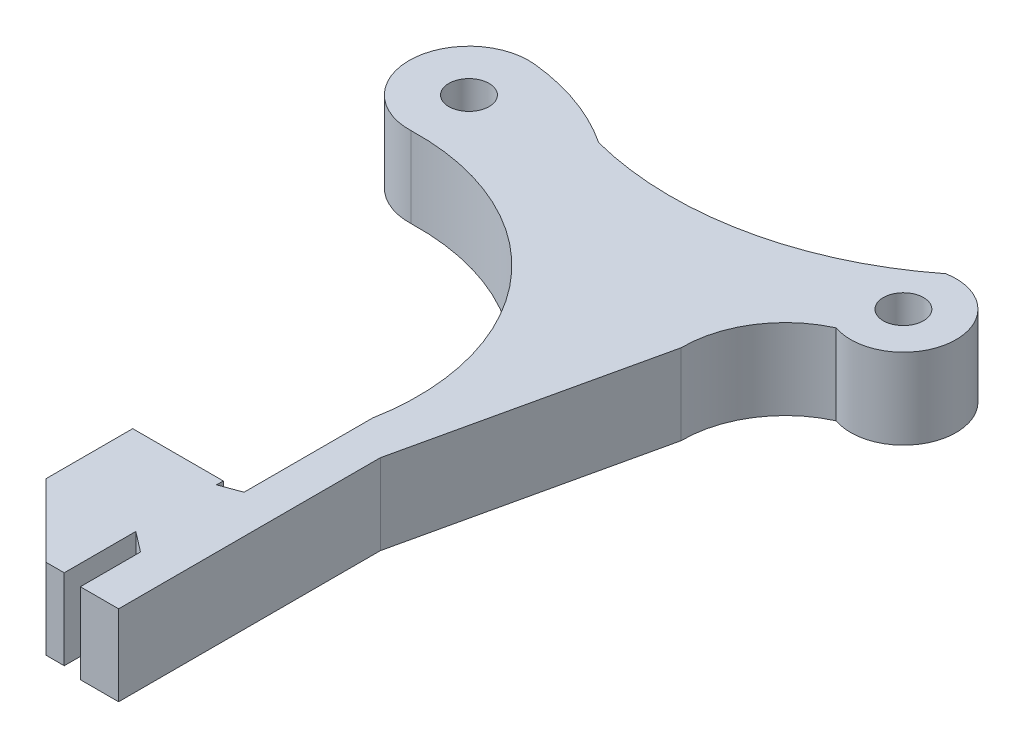
ISO-10303-21;
HEADER;
FILE_DESCRIPTION(('STEP AP214'),'2;1');
FILE_NAME('part.step','',(''),(''),'','','');
FILE_SCHEMA(('AUTOMOTIVE_DESIGN { 1 0 10303 214 1 1 1 1 }'));
ENDSEC;
DATA;
#1=APPLICATION_CONTEXT('core data for automotive mechanical design processes');
#2=APPLICATION_PROTOCOL_DEFINITION('international standard','automotive_design',2000,#1);
#3=PRODUCT_CONTEXT('',#1,'mechanical');
#4=PRODUCT('Part','Part','',(#3));
#5=PRODUCT_RELATED_PRODUCT_CATEGORY('part','',(#4));
#6=PRODUCT_DEFINITION_FORMATION('','',#4);
#7=PRODUCT_DEFINITION_CONTEXT('part definition',#1,'design');
#8=PRODUCT_DEFINITION('design','',#6,#7);
#9=PRODUCT_DEFINITION_SHAPE('','',#8);
#10=(LENGTH_UNIT() NAMED_UNIT(*) SI_UNIT(.MILLI.,.METRE.));
#11=(NAMED_UNIT(*) PLANE_ANGLE_UNIT() SI_UNIT($,.RADIAN.));
#12=(NAMED_UNIT(*) SI_UNIT($,.STERADIAN.) SOLID_ANGLE_UNIT());
#13=UNCERTAINTY_MEASURE_WITH_UNIT(LENGTH_MEASURE(1.E-05),#10,'distance_accuracy_value','');
#14=(GEOMETRIC_REPRESENTATION_CONTEXT(3) GLOBAL_UNCERTAINTY_ASSIGNED_CONTEXT((#13)) GLOBAL_UNIT_ASSIGNED_CONTEXT((#10,
#11,#12)) REPRESENTATION_CONTEXT('',''));
#15=CARTESIAN_POINT('',(0.,0.,0.));
#16=DIRECTION('',(0.,0.,1.));
#17=DIRECTION('',(1.,0.,0.));
#18=AXIS2_PLACEMENT_3D('',#15,#16,#17);
#19=CARTESIAN_POINT('',(29.4384156793673,10.,2.55506738943392));
#20=DIRECTION('',(0.607857799966434,0.,-0.794045902338125));
#21=DIRECTION('',(-0.794045902338125,0.,-0.607857799966434));
#22=AXIS2_PLACEMENT_3D('',#19,#20,#21);
#23=PLANE('',#22);
#24=DIRECTION('',(0.,-1.,0.));
#25=VECTOR('',#24,1.);
#26=CARTESIAN_POINT('',(28.75,10.,2.02807160859757));
#27=LINE('',#26,#25);
#28=CARTESIAN_POINT('',(28.75,10.,2.02807160859757));
#29=VERTEX_POINT('',#28);
#30=CARTESIAN_POINT('',(28.75,0.,2.02807160859757));
#31=VERTEX_POINT('',#30);
#32=EDGE_CURVE('E63',#29,#31,#27,.T.);
#33=ORIENTED_EDGE('',*,*,#32,.F.);
#34=DIRECTION('',(0.794045902338125,0.,0.607857799966434));
#35=VECTOR('',#34,1.);
#36=CARTESIAN_POINT('',(29.4384156793673,10.,2.55506738943392));
#37=LINE('',#36,#35);
#38=CARTESIAN_POINT('',(26.25,10.,0.114272298707066));
#39=VERTEX_POINT('',#38);
#40=EDGE_CURVE('E183',#39,#29,#37,.T.);
#41=ORIENTED_EDGE('',*,*,#40,.F.);
#42=DIRECTION('',(0.,-1.,0.));
#43=VECTOR('',#42,1.);
#44=CARTESIAN_POINT('',(26.25,10.,0.114272298707066));
#45=LINE('',#44,#43);
#46=CARTESIAN_POINT('',(26.25,0.,0.114272298707066));
#47=VERTEX_POINT('',#46);
#48=EDGE_CURVE('E229',#39,#47,#45,.T.);
#49=ORIENTED_EDGE('',*,*,#48,.T.);
#50=DIRECTION('',(0.794045902338125,0.,0.607857799966434));
#51=VECTOR('',#50,1.);
#52=CARTESIAN_POINT('',(29.4384156793673,0.,2.55506738943392));
#53=LINE('',#52,#51);
#54=EDGE_CURVE('E68',#47,#31,#53,.T.);
#55=ORIENTED_EDGE('',*,*,#54,.T.);
#56=EDGE_LOOP('',(#33,#41,#49,#55));
#57=FACE_BOUND('',#56,.T.);
#58=ADVANCED_FACE('F45',(#57),#23,.F.);
#59=CARTESIAN_POINT('',(26.25,10.,-9.9119859171796));
#60=DIRECTION('',(0.342233287778515,0.,0.939615015171803));
#61=DIRECTION('',(0.939615015171803,0.,-0.342233287778515));
#62=AXIS2_PLACEMENT_3D('',#59,#60,#61);
#63=PLANE('',#62);
#64=DIRECTION('',(0.,1.,0.));
#65=VECTOR('',#64,1.);
#66=CARTESIAN_POINT('',(28.75,10.,-10.8225537621282));
#67=LINE('',#66,#65);
#68=CARTESIAN_POINT('',(28.75,0.,-10.8225537621282));
#69=VERTEX_POINT('',#68);
#70=CARTESIAN_POINT('',(28.75,10.,-10.8225537621282));
#71=VERTEX_POINT('',#70);
#72=EDGE_CURVE('E205',#69,#71,#67,.T.);
#73=ORIENTED_EDGE('',*,*,#72,.F.);
#74=DIRECTION('',(-0.939615015171803,0.,0.342233287778515));
#75=VECTOR('',#74,1.);
#76=CARTESIAN_POINT('',(26.25,0.,-9.9119859171796));
#77=LINE('',#76,#75);
#78=CARTESIAN_POINT('',(26.25,0.,-9.9119859171796));
#79=VERTEX_POINT('',#78);
#80=EDGE_CURVE('E251',#69,#79,#77,.T.);
#81=ORIENTED_EDGE('',*,*,#80,.T.);
#82=DIRECTION('',(0.,-1.,0.));
#83=VECTOR('',#82,1.);
#84=CARTESIAN_POINT('',(26.25,10.,-9.9119859171796));
#85=LINE('',#84,#83);
#86=CARTESIAN_POINT('',(26.25,10.,-9.9119859171796));
#87=VERTEX_POINT('',#86);
#88=EDGE_CURVE('E232',#87,#79,#85,.T.);
#89=ORIENTED_EDGE('',*,*,#88,.F.);
#90=DIRECTION('',(-0.939615015171803,0.,0.342233287778515));
#91=VECTOR('',#90,1.);
#92=CARTESIAN_POINT('',(26.25,10.,-9.9119859171796));
#93=LINE('',#92,#91);
#94=EDGE_CURVE('E269',#71,#87,#93,.T.);
#95=ORIENTED_EDGE('',*,*,#94,.F.);
#96=EDGE_LOOP('',(#73,#81,#89,#95));
#97=FACE_BOUND('',#96,.T.);
#98=ADVANCED_FACE('F304',(#97),#63,.F.);
#99=CARTESIAN_POINT('',(15.,10.,-10.75));
#100=DIRECTION('',(1.,0.,0.));
#101=DIRECTION('',(0.,0.,-1.));
#102=AXIS2_PLACEMENT_3D('',#99,#100,#101);
#103=PLANE('',#102);
#104=DIRECTION('',(0.,0.,1.));
#105=VECTOR('',#104,1.);
#106=CARTESIAN_POINT('',(15.,0.,-10.75));
#107=LINE('',#106,#105);
#108=CARTESIAN_POINT('',(15.,0.,-10.75));
#109=VERTEX_POINT('',#108);
#110=CARTESIAN_POINT('',(15.,0.,0.));
#111=VERTEX_POINT('',#110);
#112=EDGE_CURVE('E11',#109,#111,#107,.T.);
#113=ORIENTED_EDGE('',*,*,#112,.T.);
#114=DIRECTION('',(0.,-1.,0.));
#115=VECTOR('',#114,1.);
#116=CARTESIAN_POINT('',(15.,10.,0.));
#117=LINE('',#116,#115);
#118=CARTESIAN_POINT('',(15.,10.,0.));
#119=VERTEX_POINT('',#118);
#120=EDGE_CURVE('E217',#119,#111,#117,.T.);
#121=ORIENTED_EDGE('',*,*,#120,.F.);
#122=DIRECTION('',(0.,0.,1.));
#123=VECTOR('',#122,1.);
#124=CARTESIAN_POINT('',(15.,10.,-10.75));
#125=LINE('',#124,#123);
#126=CARTESIAN_POINT('',(15.,10.,-10.75));
#127=VERTEX_POINT('',#126);
#128=EDGE_CURVE('E49',#127,#119,#125,.T.);
#129=ORIENTED_EDGE('',*,*,#128,.F.);
#130=DIRECTION('',(0.,-1.,0.));
#131=VECTOR('',#130,1.);
#132=CARTESIAN_POINT('',(15.,10.,-10.75));
#133=LINE('',#132,#131);
#134=EDGE_CURVE('E240',#127,#109,#133,.T.);
#135=ORIENTED_EDGE('',*,*,#134,.T.);
#136=EDGE_LOOP('',(#113,#121,#129,#135));
#137=FACE_BOUND('',#136,.T.);
#138=ADVANCED_FACE('F289',(#137),#103,.F.);
#139=CARTESIAN_POINT('',(15.,10.,0.));
#140=DIRECTION('',(0.707705839144414,0.,-0.706507215278727));
#141=DIRECTION('',(-0.706507215278727,0.,-0.707705839144414));
#142=AXIS2_PLACEMENT_3D('',#139,#140,#141);
#143=PLANE('',#142);
#144=DIRECTION('',(0.706507215278727,0.,0.707705839144414));
#145=VECTOR('',#144,1.);
#146=CARTESIAN_POINT('',(15.,0.,0.));
#147=LINE('',#146,#145);
#148=CARTESIAN_POINT('',(23.984756922729,0.,9.));
#149=VERTEX_POINT('',#148);
#150=EDGE_CURVE('E55',#111,#149,#147,.T.);
#151=ORIENTED_EDGE('',*,*,#150,.T.);
#152=DIRECTION('',(0.,-1.,0.));
#153=VECTOR('',#152,1.);
#154=CARTESIAN_POINT('',(23.984756922729,10.,9.));
#155=LINE('',#154,#153);
#156=CARTESIAN_POINT('',(23.984756922729,10.,9.));
#157=VERTEX_POINT('',#156);
#158=EDGE_CURVE('E221',#157,#149,#155,.T.);
#159=ORIENTED_EDGE('',*,*,#158,.F.);
#160=DIRECTION('',(0.706507215278727,0.,0.707705839144414));
#161=VECTOR('',#160,1.);
#162=CARTESIAN_POINT('',(15.,10.,0.));
#163=LINE('',#162,#161);
#164=EDGE_CURVE('E279',#119,#157,#163,.T.);
#165=ORIENTED_EDGE('',*,*,#164,.F.);
#166=ORIENTED_EDGE('',*,*,#120,.T.);
#167=EDGE_LOOP('',(#151,#159,#165,#166));
#168=FACE_BOUND('',#167,.T.);
#169=ADVANCED_FACE('F292',(#168),#143,.F.);
#170=CARTESIAN_POINT('',(23.984756922729,10.,9.));
#171=DIRECTION('',(0.,0.,-1.));
#172=DIRECTION('',(-1.,0.,0.));
#173=AXIS2_PLACEMENT_3D('',#170,#171,#172);
#174=PLANE('',#173);
#175=DIRECTION('',(1.,0.,0.));
#176=VECTOR('',#175,1.);
#177=CARTESIAN_POINT('',(23.984756922729,0.,9.));
#178=LINE('',#177,#176);
#179=CARTESIAN_POINT('',(26.25,0.,9.));
#180=VERTEX_POINT('',#179);
#181=EDGE_CURVE('E259',#149,#180,#178,.T.);
#182=ORIENTED_EDGE('',*,*,#181,.T.);
#183=DIRECTION('',(0.,-1.,0.));
#184=VECTOR('',#183,1.);
#185=CARTESIAN_POINT('',(26.25,10.,9.));
#186=LINE('',#185,#184);
#187=CARTESIAN_POINT('',(26.25,10.,9.));
#188=VERTEX_POINT('',#187);
#189=EDGE_CURVE('E225',#188,#180,#186,.T.);
#190=ORIENTED_EDGE('',*,*,#189,.F.);
#191=DIRECTION('',(1.,0.,0.));
#192=VECTOR('',#191,1.);
#193=CARTESIAN_POINT('',(23.984756922729,10.,9.));
#194=LINE('',#193,#192);
#195=EDGE_CURVE('E277',#157,#188,#194,.T.);
#196=ORIENTED_EDGE('',*,*,#195,.F.);
#197=ORIENTED_EDGE('',*,*,#158,.T.);
#198=EDGE_LOOP('',(#182,#190,#196,#197));
#199=FACE_BOUND('',#198,.T.);
#200=ADVANCED_FACE('F297',(#199),#174,.F.);
#201=CARTESIAN_POINT('',(26.25,10.,9.));
#202=DIRECTION('',(-1.,0.,0.));
#203=DIRECTION('',(0.,0.,1.));
#204=AXIS2_PLACEMENT_3D('',#201,#202,#203);
#205=PLANE('',#204);
#206=DIRECTION('',(0.,0.,-1.));
#207=VECTOR('',#206,1.);
#208=CARTESIAN_POINT('',(26.25,0.,9.));
#209=LINE('',#208,#207);
#210=EDGE_CURVE('E256',#180,#47,#209,.T.);
#211=ORIENTED_EDGE('',*,*,#210,.T.);
#212=ORIENTED_EDGE('',*,*,#48,.F.);
#213=DIRECTION('',(0.,0.,-1.));
#214=VECTOR('',#213,1.);
#215=CARTESIAN_POINT('',(26.25,10.,9.));
#216=LINE('',#215,#214);
#217=EDGE_CURVE('E274',#188,#39,#216,.T.);
#218=ORIENTED_EDGE('',*,*,#217,.F.);
#219=ORIENTED_EDGE('',*,*,#189,.T.);
#220=EDGE_LOOP('',(#211,#212,#218,#219));
#221=FACE_BOUND('',#220,.T.);
#222=ADVANCED_FACE('F301',(#221),#205,.F.);
#223=CARTESIAN_POINT('',(26.25,10.,-10.75));
#224=DIRECTION('',(-1.,0.,0.));
#225=DIRECTION('',(0.,0.,1.));
#226=AXIS2_PLACEMENT_3D('',#223,#224,#225);
#227=PLANE('',#226);
#228=DIRECTION('',(0.,0.,-1.));
#229=VECTOR('',#228,1.);
#230=CARTESIAN_POINT('',(26.25,0.,-10.75));
#231=LINE('',#230,#229);
#232=CARTESIAN_POINT('',(26.25,0.,-10.75));
#233=VERTEX_POINT('',#232);
#234=EDGE_CURVE('E248',#79,#233,#231,.T.);
#235=ORIENTED_EDGE('',*,*,#234,.T.);
#236=DIRECTION('',(0.,-1.,0.));
#237=VECTOR('',#236,1.);
#238=CARTESIAN_POINT('',(26.25,10.,-10.75));
#239=LINE('',#238,#237);
#240=CARTESIAN_POINT('',(26.25,10.,-10.75));
#241=VERTEX_POINT('',#240);
#242=EDGE_CURVE('E236',#241,#233,#239,.T.);
#243=ORIENTED_EDGE('',*,*,#242,.F.);
#244=DIRECTION('',(0.,0.,-1.));
#245=VECTOR('',#244,1.);
#246=CARTESIAN_POINT('',(26.25,10.,-10.75));
#247=LINE('',#246,#245);
#248=EDGE_CURVE('E266',#87,#241,#247,.T.);
#249=ORIENTED_EDGE('',*,*,#248,.F.);
#250=ORIENTED_EDGE('',*,*,#88,.T.);
#251=EDGE_LOOP('',(#235,#243,#249,#250));
#252=FACE_BOUND('',#251,.T.);
#253=ADVANCED_FACE('F315',(#252),#227,.F.);
#254=CARTESIAN_POINT('',(26.25,10.,-10.75));
#255=DIRECTION('',(0.,0.,1.));
#256=DIRECTION('',(1.,0.,0.));
#257=AXIS2_PLACEMENT_3D('',#254,#255,#256);
#258=PLANE('',#257);
#259=DIRECTION('',(-1.,0.,0.));
#260=VECTOR('',#259,1.);
#261=CARTESIAN_POINT('',(26.25,0.,-10.75));
#262=LINE('',#261,#260);
#263=EDGE_CURVE('E245',#233,#109,#262,.T.);
#264=ORIENTED_EDGE('',*,*,#263,.T.);
#265=ORIENTED_EDGE('',*,*,#134,.F.);
#266=DIRECTION('',(-1.,0.,0.));
#267=VECTOR('',#266,1.);
#268=CARTESIAN_POINT('',(26.25,10.,-10.75));
#269=LINE('',#268,#267);
#270=EDGE_CURVE('E244',#241,#127,#269,.T.);
#271=ORIENTED_EDGE('',*,*,#270,.F.);
#272=ORIENTED_EDGE('',*,*,#242,.T.);
#273=EDGE_LOOP('',(#264,#265,#271,#272));
#274=FACE_BOUND('',#273,.T.);
#275=ADVANCED_FACE('F318',(#274),#258,.F.);
#276=CARTESIAN_POINT('',(0.,10.,0.));
#277=DIRECTION('',(0.,1.,0.));
#278=DIRECTION('',(0.,0.,1.));
#279=AXIS2_PLACEMENT_3D('',#276,#277,#278);
#280=PLANE('',#279);
#281=ORIENTED_EDGE('',*,*,#40,.T.);
#282=DIRECTION('',(0.,0.,1.));
#283=VECTOR('',#282,1.);
#284=CARTESIAN_POINT('',(28.75,10.,9.5));
#285=LINE('',#284,#283);
#286=CARTESIAN_POINT('',(28.75,10.,9.5));
#287=VERTEX_POINT('',#286);
#288=EDGE_CURVE('E178',#29,#287,#285,.T.);
#289=ORIENTED_EDGE('',*,*,#288,.T.);
#290=DIRECTION('',(1.,0.,0.));
#291=VECTOR('',#290,1.);
#292=CARTESIAN_POINT('',(28.75,10.,9.5));
#293=LINE('',#292,#291);
#294=CARTESIAN_POINT('',(33.5,10.,9.5));
#295=VERTEX_POINT('',#294);
#296=EDGE_CURVE('E181',#287,#295,#293,.T.);
#297=ORIENTED_EDGE('',*,*,#296,.T.);
#298=DIRECTION('',(0.,0.,-1.));
#299=VECTOR('',#298,1.);
#300=CARTESIAN_POINT('',(33.5,10.,9.5));
#301=LINE('',#300,#299);
#302=CARTESIAN_POINT('',(33.5,10.,-22.9964795118963));
#303=VERTEX_POINT('',#302);
#304=EDGE_CURVE('E198',#295,#303,#301,.T.);
#305=ORIENTED_EDGE('',*,*,#304,.T.);
#306=DIRECTION('',(0.219110296994239,0.,-0.975700096213532));
#307=VECTOR('',#306,1.);
#308=CARTESIAN_POINT('',(33.5,10.,-22.9964795118963));
#309=LINE('',#308,#307);
#310=CARTESIAN_POINT('',(40.3451918816469,10.,-53.4781796836529));
#311=VERTEX_POINT('',#310);
#312=EDGE_CURVE('E355',#303,#311,#309,.T.);
#313=ORIENTED_EDGE('',*,*,#312,.T.);
#314=CARTESIAN_POINT('',(53.1709551408232,10.,-53.5974267366871));
#315=DIRECTION('',(0.,-1.,0.));
#316=DIRECTION('',(0.,0.,-1.));
#317=AXIS2_PLACEMENT_3D('',#314,#315,#316);
#318=CIRCLE('',#317,12.8263175946994);
#319=CARTESIAN_POINT('',(47.8361175296124,10.,-65.2616425569686));
#320=VERTEX_POINT('',#319);
#321=EDGE_CURVE('E358',#311,#320,#318,.T.);
#322=ORIENTED_EDGE('',*,*,#321,.T.);
#323=CARTESIAN_POINT('',(50.,10.,-71.4441639009332));
#324=DIRECTION('',(0.,1.,0.));
#325=DIRECTION('',(0.,0.,1.));
#326=AXIS2_PLACEMENT_3D('',#323,#324,#325);
#327=CIRCLE('',#326,6.55026392706654);
#328=CARTESIAN_POINT('',(48.8157417172947,10.,-77.8864841222567));
#329=VERTEX_POINT('',#328);
#330=EDGE_CURVE('E361',#320,#329,#327,.T.);
#331=ORIENTED_EDGE('',*,*,#330,.T.);
#332=CARTESIAN_POINT('',(23.4650928294995,10.,-110.161503233853));
#333=DIRECTION('',(0.,-1.,0.));
#334=DIRECTION('',(0.,0.,1.));
#335=AXIS2_PLACEMENT_3D('',#332,#333,#334);
#336=CIRCLE('',#335,41.0406171698983);
#337=CARTESIAN_POINT('',(13.1801068471703,10.,-70.4305163215011));
#338=VERTEX_POINT('',#337);
#339=EDGE_CURVE('E364',#329,#338,#336,.T.);
#340=ORIENTED_EDGE('',*,*,#339,.T.);
#341=CARTESIAN_POINT('',(-2.07481433490464,10.,-47.4665819523747));
#342=DIRECTION('',(0.,1.,0.));
#343=DIRECTION('',(0.,0.,-1.));
#344=AXIS2_PLACEMENT_3D('',#341,#342,#343);
#345=CIRCLE('',#344,27.5690932382779);
#346=CARTESIAN_POINT('',(0.765261216815038,10.,-74.8889974703663));
#347=VERTEX_POINT('',#346);
#348=EDGE_CURVE('E367',#338,#347,#345,.T.);
#349=ORIENTED_EDGE('',*,*,#348,.T.);
#350=CARTESIAN_POINT('',(0.,10.,-67.5));
#351=DIRECTION('',(0.,1.,0.));
#352=DIRECTION('',(0.,0.,1.));
#353=AXIS2_PLACEMENT_3D('',#350,#351,#352);
#354=CIRCLE('',#353,7.4285199297734);
#355=CARTESIAN_POINT('',(0.226137572536466,10.,-60.0749228862369));
#356=VERTEX_POINT('',#355);
#357=EDGE_CURVE('E370',#347,#356,#354,.T.);
#358=ORIENTED_EDGE('',*,*,#357,.T.);
#359=CARTESIAN_POINT('',(1.08287422660641,10.,-31.944543439315));
#360=DIRECTION('',(0.,-1.,0.));
#361=DIRECTION('',(0.,0.,-1.));
#362=AXIS2_PLACEMENT_3D('',#359,#360,#361);
#363=CIRCLE('',#362,28.1434227755303);
#364=CARTESIAN_POINT('',(28.75,10.,-26.7887314798407));
#365=VERTEX_POINT('',#364);
#366=EDGE_CURVE('E373',#356,#365,#363,.T.);
#367=ORIENTED_EDGE('',*,*,#366,.T.);
#368=EDGE_CURVE('E187',#365,#71,#285,.T.);
#369=ORIENTED_EDGE('',*,*,#368,.T.);
#370=ORIENTED_EDGE('',*,*,#94,.T.);
#371=ORIENTED_EDGE('',*,*,#248,.T.);
#372=ORIENTED_EDGE('',*,*,#270,.T.);
#373=ORIENTED_EDGE('',*,*,#128,.T.);
#374=ORIENTED_EDGE('',*,*,#164,.T.);
#375=ORIENTED_EDGE('',*,*,#195,.T.);
#376=ORIENTED_EDGE('',*,*,#217,.T.);
#377=EDGE_LOOP('',(#281,#289,#297,#305,#313,#322,#331,#340,#349,#358,#367,#369,#370,#371,#372,
#373,#374,#375,#376));
#378=FACE_BOUND('',#377,.T.);
#379=CARTESIAN_POINT('',(0.,10.,-67.5));
#380=DIRECTION('',(0.,1.,0.));
#381=DIRECTION('',(0.,0.,1.));
#382=AXIS2_PLACEMENT_3D('',#379,#380,#381);
#383=CIRCLE('',#382,2.5);
#384=CARTESIAN_POINT('',(0.,10.,-65.));
#385=VERTEX_POINT('',#384);
#386=EDGE_CURVE('E340',#385,#385,#383,.T.);
#387=ORIENTED_EDGE('',*,*,#386,.F.);
#388=EDGE_LOOP('',(#387));
#389=FACE_BOUND('',#388,.T.);
#390=CARTESIAN_POINT('',(50.,10.,-71.4441639009332));
#391=DIRECTION('',(0.,1.,0.));
#392=DIRECTION('',(0.,0.,1.));
#393=AXIS2_PLACEMENT_3D('',#390,#391,#392);
#394=CIRCLE('',#393,2.5);
#395=CARTESIAN_POINT('',(50.,10.,-68.9441639009332));
#396=VERTEX_POINT('',#395);
#397=EDGE_CURVE('E341',#396,#396,#394,.T.);
#398=ORIENTED_EDGE('',*,*,#397,.F.);
#399=EDGE_LOOP('',(#398));
#400=FACE_BOUND('',#399,.T.);
#401=ADVANCED_FACE('F47',(#378,#389,#400),#280,.T.);
#402=CARTESIAN_POINT('',(0.,0.,0.));
#403=DIRECTION('',(0.,1.,0.));
#404=DIRECTION('',(0.,0.,1.));
#405=AXIS2_PLACEMENT_3D('',#402,#403,#404);
#406=PLANE('',#405);
#407=DIRECTION('',(0.,0.,1.));
#408=VECTOR('',#407,1.);
#409=CARTESIAN_POINT('',(28.75,0.,9.5));
#410=LINE('',#409,#408);
#411=CARTESIAN_POINT('',(28.75,0.,9.5));
#412=VERTEX_POINT('',#411);
#413=EDGE_CURVE('E202',#31,#412,#410,.T.);
#414=ORIENTED_EDGE('',*,*,#413,.F.);
#415=ORIENTED_EDGE('',*,*,#54,.F.);
#416=ORIENTED_EDGE('',*,*,#210,.F.);
#417=ORIENTED_EDGE('',*,*,#181,.F.);
#418=ORIENTED_EDGE('',*,*,#150,.F.);
#419=ORIENTED_EDGE('',*,*,#112,.F.);
#420=ORIENTED_EDGE('',*,*,#263,.F.);
#421=ORIENTED_EDGE('',*,*,#234,.F.);
#422=ORIENTED_EDGE('',*,*,#80,.F.);
#423=CARTESIAN_POINT('',(28.75,0.,-26.7887314798407));
#424=VERTEX_POINT('',#423);
#425=EDGE_CURVE('E377',#424,#69,#410,.T.);
#426=ORIENTED_EDGE('',*,*,#425,.F.);
#427=CARTESIAN_POINT('',(1.08287422660641,0.,-31.944543439315));
#428=DIRECTION('',(0.,-1.,0.));
#429=DIRECTION('',(0.,0.,-1.));
#430=AXIS2_PLACEMENT_3D('',#427,#428,#429);
#431=CIRCLE('',#430,28.1434227755303);
#432=CARTESIAN_POINT('',(0.226137572536466,0.,-60.0749228862369));
#433=VERTEX_POINT('',#432);
#434=EDGE_CURVE('E188',#433,#424,#431,.T.);
#435=ORIENTED_EDGE('',*,*,#434,.F.);
#436=CARTESIAN_POINT('',(0.,0.,-67.5));
#437=DIRECTION('',(0.,1.,0.));
#438=DIRECTION('',(0.,0.,1.));
#439=AXIS2_PLACEMENT_3D('',#436,#437,#438);
#440=CIRCLE('',#439,7.4285199297734);
#441=CARTESIAN_POINT('',(0.765261216815038,0.,-74.8889974703663));
#442=VERTEX_POINT('',#441);
#443=EDGE_CURVE('E402',#442,#433,#440,.T.);
#444=ORIENTED_EDGE('',*,*,#443,.F.);
#445=CARTESIAN_POINT('',(-2.07481433490464,0.,-47.4665819523747));
#446=DIRECTION('',(0.,1.,0.));
#447=DIRECTION('',(0.,0.,-1.));
#448=AXIS2_PLACEMENT_3D('',#445,#446,#447);
#449=CIRCLE('',#448,27.5690932382779);
#450=CARTESIAN_POINT('',(13.1801068471703,0.,-70.4305163215011));
#451=VERTEX_POINT('',#450);
#452=EDGE_CURVE('E399',#451,#442,#449,.T.);
#453=ORIENTED_EDGE('',*,*,#452,.F.);
#454=CARTESIAN_POINT('',(23.4650928294995,0.,-110.161503233853));
#455=DIRECTION('',(0.,-1.,0.));
#456=DIRECTION('',(0.,0.,1.));
#457=AXIS2_PLACEMENT_3D('',#454,#455,#456);
#458=CIRCLE('',#457,41.0406171698983);
#459=CARTESIAN_POINT('',(48.8157417172947,0.,-77.8864841222567));
#460=VERTEX_POINT('',#459);
#461=EDGE_CURVE('E396',#460,#451,#458,.T.);
#462=ORIENTED_EDGE('',*,*,#461,.F.);
#463=CARTESIAN_POINT('',(50.,0.,-71.4441639009332));
#464=DIRECTION('',(0.,1.,0.));
#465=DIRECTION('',(0.,0.,1.));
#466=AXIS2_PLACEMENT_3D('',#463,#464,#465);
#467=CIRCLE('',#466,6.55026392706654);
#468=CARTESIAN_POINT('',(47.8361175296124,0.,-65.2616425569686));
#469=VERTEX_POINT('',#468);
#470=EDGE_CURVE('E393',#469,#460,#467,.T.);
#471=ORIENTED_EDGE('',*,*,#470,.F.);
#472=CARTESIAN_POINT('',(53.1709551408232,0.,-53.5974267366871));
#473=DIRECTION('',(0.,-1.,0.));
#474=DIRECTION('',(0.,0.,-1.));
#475=AXIS2_PLACEMENT_3D('',#472,#473,#474);
#476=CIRCLE('',#475,12.8263175946994);
#477=CARTESIAN_POINT('',(40.3451918816469,0.,-53.4781796836529));
#478=VERTEX_POINT('',#477);
#479=EDGE_CURVE('E390',#478,#469,#476,.T.);
#480=ORIENTED_EDGE('',*,*,#479,.F.);
#481=DIRECTION('',(0.219110296994239,0.,-0.975700096213532));
#482=VECTOR('',#481,1.);
#483=CARTESIAN_POINT('',(33.5,0.,-22.9964795118963));
#484=LINE('',#483,#482);
#485=CARTESIAN_POINT('',(33.5,0.,-22.9964795118963));
#486=VERTEX_POINT('',#485);
#487=EDGE_CURVE('E387',#486,#478,#484,.T.);
#488=ORIENTED_EDGE('',*,*,#487,.F.);
#489=DIRECTION('',(0.,0.,-1.));
#490=VECTOR('',#489,1.);
#491=CARTESIAN_POINT('',(33.5,0.,9.5));
#492=LINE('',#491,#490);
#493=CARTESIAN_POINT('',(33.5,0.,9.5));
#494=VERTEX_POINT('',#493);
#495=EDGE_CURVE('E384',#494,#486,#492,.T.);
#496=ORIENTED_EDGE('',*,*,#495,.F.);
#497=DIRECTION('',(1.,0.,0.));
#498=VECTOR('',#497,1.);
#499=CARTESIAN_POINT('',(28.75,0.,9.5));
#500=LINE('',#499,#498);
#501=EDGE_CURVE('E381',#412,#494,#500,.T.);
#502=ORIENTED_EDGE('',*,*,#501,.F.);
#503=EDGE_LOOP('',(#414,#415,#416,#417,#418,#419,#420,#421,#422,#426,#435,#444,#453,#462,#471,
#480,#488,#496,#502));
#504=FACE_BOUND('',#503,.T.);
#505=CARTESIAN_POINT('',(50.,0.,-71.4441639009332));
#506=DIRECTION('',(0.,1.,0.));
#507=DIRECTION('',(0.,0.,1.));
#508=AXIS2_PLACEMENT_3D('',#505,#506,#507);
#509=CIRCLE('',#508,2.5);
#510=CARTESIAN_POINT('',(50.,0.,-68.9441639009332));
#511=VERTEX_POINT('',#510);
#512=EDGE_CURVE('E334',#511,#511,#509,.T.);
#513=ORIENTED_EDGE('',*,*,#512,.T.);
#514=EDGE_LOOP('',(#513));
#515=FACE_BOUND('',#514,.T.);
#516=CARTESIAN_POINT('',(0.,0.,-67.5));
#517=DIRECTION('',(0.,1.,0.));
#518=DIRECTION('',(0.,0.,1.));
#519=AXIS2_PLACEMENT_3D('',#516,#517,#518);
#520=CIRCLE('',#519,2.5);
#521=CARTESIAN_POINT('',(0.,0.,-65.));
#522=VERTEX_POINT('',#521);
#523=EDGE_CURVE('E337',#522,#522,#520,.T.);
#524=ORIENTED_EDGE('',*,*,#523,.T.);
#525=EDGE_LOOP('',(#524));
#526=FACE_BOUND('',#525,.T.);
#527=ADVANCED_FACE('F321',(#504,#515,#526),#406,.F.);
#528=CARTESIAN_POINT('',(28.75,10.,9.5));
#529=DIRECTION('',(1.,0.,0.));
#530=DIRECTION('',(0.,0.,-1.));
#531=AXIS2_PLACEMENT_3D('',#528,#529,#530);
#532=PLANE('',#531);
#533=ORIENTED_EDGE('',*,*,#288,.F.);
#534=ORIENTED_EDGE('',*,*,#32,.T.);
#535=ORIENTED_EDGE('',*,*,#413,.T.);
#536=DIRECTION('',(0.,-1.,0.));
#537=VECTOR('',#536,1.);
#538=CARTESIAN_POINT('',(28.75,10.,9.5));
#539=LINE('',#538,#537);
#540=EDGE_CURVE('E193',#287,#412,#539,.T.);
#541=ORIENTED_EDGE('',*,*,#540,.F.);
#542=EDGE_LOOP('',(#533,#534,#535,#541));
#543=FACE_BOUND('',#542,.T.);
#544=ADVANCED_FACE('F200',(#543),#532,.F.);
#545=ORIENTED_EDGE('',*,*,#425,.T.);
#546=ORIENTED_EDGE('',*,*,#72,.T.);
#547=ORIENTED_EDGE('',*,*,#368,.F.);
#548=DIRECTION('',(0.,-1.,0.));
#549=VECTOR('',#548,1.);
#550=CARTESIAN_POINT('',(28.75,10.,-26.7887314798407));
#551=LINE('',#550,#549);
#552=EDGE_CURVE('E376',#365,#424,#551,.T.);
#553=ORIENTED_EDGE('',*,*,#552,.T.);
#554=EDGE_LOOP('',(#545,#546,#547,#553));
#555=FACE_BOUND('',#554,.T.);
#556=ADVANCED_FACE('F328',(#555),#532,.F.);
#557=CARTESIAN_POINT('',(28.75,10.,9.5));
#558=DIRECTION('',(0.,0.,-1.));
#559=DIRECTION('',(-1.,0.,0.));
#560=AXIS2_PLACEMENT_3D('',#557,#558,#559);
#561=PLANE('',#560);
#562=ORIENTED_EDGE('',*,*,#501,.T.);
#563=DIRECTION('',(0.,-1.,0.));
#564=VECTOR('',#563,1.);
#565=CARTESIAN_POINT('',(33.5,10.,9.5));
#566=LINE('',#565,#564);
#567=EDGE_CURVE('E195',#295,#494,#566,.T.);
#568=ORIENTED_EDGE('',*,*,#567,.F.);
#569=ORIENTED_EDGE('',*,*,#296,.F.);
#570=ORIENTED_EDGE('',*,*,#540,.T.);
#571=EDGE_LOOP('',(#562,#568,#569,#570));
#572=FACE_BOUND('',#571,.T.);
#573=ADVANCED_FACE('F192',(#572),#561,.F.);
#574=CARTESIAN_POINT('',(33.5,10.,9.5));
#575=DIRECTION('',(-1.,0.,0.));
#576=DIRECTION('',(0.,0.,1.));
#577=AXIS2_PLACEMENT_3D('',#574,#575,#576);
#578=PLANE('',#577);
#579=ORIENTED_EDGE('',*,*,#495,.T.);
#580=DIRECTION('',(0.,-1.,0.));
#581=VECTOR('',#580,1.);
#582=CARTESIAN_POINT('',(33.5,10.,-22.9964795118963));
#583=LINE('',#582,#581);
#584=EDGE_CURVE('E211',#303,#486,#583,.T.);
#585=ORIENTED_EDGE('',*,*,#584,.F.);
#586=ORIENTED_EDGE('',*,*,#304,.F.);
#587=ORIENTED_EDGE('',*,*,#567,.T.);
#588=EDGE_LOOP('',(#579,#585,#586,#587));
#589=FACE_BOUND('',#588,.T.);
#590=ADVANCED_FACE('F456',(#589),#578,.F.);
#591=CARTESIAN_POINT('',(33.5,10.,-22.9964795118963));
#592=DIRECTION('',(-0.975700096213532,0.,-0.219110296994239));
#593=DIRECTION('',(-0.219110296994239,0.,0.975700096213532));
#594=AXIS2_PLACEMENT_3D('',#591,#592,#593);
#595=PLANE('',#594);
#596=ORIENTED_EDGE('',*,*,#487,.T.);
#597=DIRECTION('',(0.,-1.,0.));
#598=VECTOR('',#597,1.);
#599=CARTESIAN_POINT('',(40.3451918816469,10.,-53.4781796836529));
#600=LINE('',#599,#598);
#601=EDGE_CURVE('E430',#311,#478,#600,.T.);
#602=ORIENTED_EDGE('',*,*,#601,.F.);
#603=ORIENTED_EDGE('',*,*,#312,.F.);
#604=ORIENTED_EDGE('',*,*,#584,.T.);
#605=EDGE_LOOP('',(#596,#602,#603,#604));
#606=FACE_BOUND('',#605,.T.);
#607=ADVANCED_FACE('F439',(#606),#595,.F.);
#608=CARTESIAN_POINT('',(53.1709551408232,10.,-53.5974267366871));
#609=DIRECTION('',(0.,-1.,0.));
#610=DIRECTION('',(0.,0.,-1.));
#611=AXIS2_PLACEMENT_3D('',#608,#609,#610);
#612=CYLINDRICAL_SURFACE('',#611,12.8263175946994);
#613=ORIENTED_EDGE('',*,*,#479,.T.);
#614=DIRECTION('',(0.,-1.,0.));
#615=VECTOR('',#614,1.);
#616=CARTESIAN_POINT('',(47.8361175296124,10.,-65.2616425569686));
#617=LINE('',#616,#615);
#618=EDGE_CURVE('E426',#320,#469,#617,.T.);
#619=ORIENTED_EDGE('',*,*,#618,.F.);
#620=ORIENTED_EDGE('',*,*,#321,.F.);
#621=ORIENTED_EDGE('',*,*,#601,.T.);
#622=EDGE_LOOP('',(#613,#619,#620,#621));
#623=FACE_BOUND('',#622,.T.);
#624=ADVANCED_FACE('F448',(#623),#612,.F.);
#625=CARTESIAN_POINT('',(50.,10.,-71.4441639009332));
#626=DIRECTION('',(0.,-1.,0.));
#627=DIRECTION('',(0.,0.,-1.));
#628=AXIS2_PLACEMENT_3D('',#625,#626,#627);
#629=CYLINDRICAL_SURFACE('',#628,6.55026392706654);
#630=ORIENTED_EDGE('',*,*,#470,.T.);
#631=DIRECTION('',(0.,-1.,0.));
#632=VECTOR('',#631,1.);
#633=CARTESIAN_POINT('',(48.8157417172947,10.,-77.8864841222567));
#634=LINE('',#633,#632);
#635=EDGE_CURVE('E422',#329,#460,#634,.T.);
#636=ORIENTED_EDGE('',*,*,#635,.F.);
#637=ORIENTED_EDGE('',*,*,#330,.F.);
#638=ORIENTED_EDGE('',*,*,#618,.T.);
#639=EDGE_LOOP('',(#630,#636,#637,#638));
#640=FACE_BOUND('',#639,.T.);
#641=ADVANCED_FACE('F452',(#640),#629,.T.);
#642=CARTESIAN_POINT('',(23.4650928294995,10.,-110.161503233853));
#643=DIRECTION('',(0.,-1.,0.));
#644=DIRECTION('',(0.,0.,-1.));
#645=AXIS2_PLACEMENT_3D('',#642,#643,#644);
#646=CYLINDRICAL_SURFACE('',#645,41.0406171698983);
#647=ORIENTED_EDGE('',*,*,#461,.T.);
#648=DIRECTION('',(0.,-1.,0.));
#649=VECTOR('',#648,1.);
#650=CARTESIAN_POINT('',(13.1801068471703,10.,-70.4305163215011));
#651=LINE('',#650,#649);
#652=EDGE_CURVE('E418',#338,#451,#651,.T.);
#653=ORIENTED_EDGE('',*,*,#652,.F.);
#654=ORIENTED_EDGE('',*,*,#339,.F.);
#655=ORIENTED_EDGE('',*,*,#635,.T.);
#656=EDGE_LOOP('',(#647,#653,#654,#655));
#657=FACE_BOUND('',#656,.T.);
#658=ADVANCED_FACE('F551',(#657),#646,.F.);
#659=CARTESIAN_POINT('',(-2.07481433490464,10.,-47.4665819523747));
#660=DIRECTION('',(0.,-1.,0.));
#661=DIRECTION('',(0.,0.,-1.));
#662=AXIS2_PLACEMENT_3D('',#659,#660,#661);
#663=CYLINDRICAL_SURFACE('',#662,27.5690932382779);
#664=ORIENTED_EDGE('',*,*,#452,.T.);
#665=DIRECTION('',(0.,-1.,0.));
#666=VECTOR('',#665,1.);
#667=CARTESIAN_POINT('',(0.765261216815038,10.,-74.8889974703663));
#668=LINE('',#667,#666);
#669=EDGE_CURVE('E414',#347,#442,#668,.T.);
#670=ORIENTED_EDGE('',*,*,#669,.F.);
#671=ORIENTED_EDGE('',*,*,#348,.F.);
#672=ORIENTED_EDGE('',*,*,#652,.T.);
#673=EDGE_LOOP('',(#664,#670,#671,#672));
#674=FACE_BOUND('',#673,.T.);
#675=ADVANCED_FACE('F559',(#674),#663,.T.);
#676=CARTESIAN_POINT('',(0.,10.,-67.5));
#677=DIRECTION('',(0.,-1.,0.));
#678=DIRECTION('',(0.,0.,-1.));
#679=AXIS2_PLACEMENT_3D('',#676,#677,#678);
#680=CYLINDRICAL_SURFACE('',#679,7.4285199297734);
#681=ORIENTED_EDGE('',*,*,#443,.T.);
#682=DIRECTION('',(0.,-1.,0.));
#683=VECTOR('',#682,1.);
#684=CARTESIAN_POINT('',(0.226137572536466,10.,-60.0749228862369));
#685=LINE('',#684,#683);
#686=EDGE_CURVE('E410',#356,#433,#685,.T.);
#687=ORIENTED_EDGE('',*,*,#686,.F.);
#688=ORIENTED_EDGE('',*,*,#357,.F.);
#689=ORIENTED_EDGE('',*,*,#669,.T.);
#690=EDGE_LOOP('',(#681,#687,#688,#689));
#691=FACE_BOUND('',#690,.T.);
#692=ADVANCED_FACE('F568',(#691),#680,.T.);
#693=CARTESIAN_POINT('',(1.08287422660641,10.,-31.944543439315));
#694=DIRECTION('',(0.,-1.,0.));
#695=DIRECTION('',(0.,0.,-1.));
#696=AXIS2_PLACEMENT_3D('',#693,#694,#695);
#697=CYLINDRICAL_SURFACE('',#696,28.1434227755303);
#698=ORIENTED_EDGE('',*,*,#434,.T.);
#699=ORIENTED_EDGE('',*,*,#552,.F.);
#700=ORIENTED_EDGE('',*,*,#366,.F.);
#701=ORIENTED_EDGE('',*,*,#686,.T.);
#702=EDGE_LOOP('',(#698,#699,#700,#701));
#703=FACE_BOUND('',#702,.T.);
#704=ADVANCED_FACE('F577',(#703),#697,.F.);
#705=CARTESIAN_POINT('',(0.,10.,-67.5));
#706=DIRECTION('',(0.,-1.,0.));
#707=DIRECTION('',(0.,0.,-1.));
#708=AXIS2_PLACEMENT_3D('',#705,#706,#707);
#709=CYLINDRICAL_SURFACE('',#708,2.5);
#710=ORIENTED_EDGE('',*,*,#386,.T.);
#711=EDGE_LOOP('',(#710));
#712=FACE_BOUND('',#711,.T.);
#713=ORIENTED_EDGE('',*,*,#523,.F.);
#714=EDGE_LOOP('',(#713));
#715=FACE_BOUND('',#714,.T.);
#716=ADVANCED_FACE('F586',(#712,#715),#709,.F.);
#717=CARTESIAN_POINT('',(50.,10.,-71.4441639009332));
#718=DIRECTION('',(0.,-1.,0.));
#719=DIRECTION('',(0.,0.,-1.));
#720=AXIS2_PLACEMENT_3D('',#717,#718,#719);
#721=CYLINDRICAL_SURFACE('',#720,2.5);
#722=ORIENTED_EDGE('',*,*,#397,.T.);
#723=EDGE_LOOP('',(#722));
#724=FACE_BOUND('',#723,.T.);
#725=ORIENTED_EDGE('',*,*,#512,.F.);
#726=EDGE_LOOP('',(#725));
#727=FACE_BOUND('',#726,.T.);
#728=ADVANCED_FACE('F595',(#724,#727),#721,.F.);
#729=CLOSED_SHELL('',(#58,#98,#138,#169,#200,#222,#253,#275,#401,#527,#544,#556,#573,#590,#607,
#624,#641,#658,#675,#692,#704,#716,#728));
#730=MANIFOLD_SOLID_BREP('B2',#729);
#731=ADVANCED_BREP_SHAPE_REPRESENTATION('',(#18,#730),#14);
#732=SHAPE_DEFINITION_REPRESENTATION(#9,#731);
ENDSEC;
END-ISO-10303-21;
